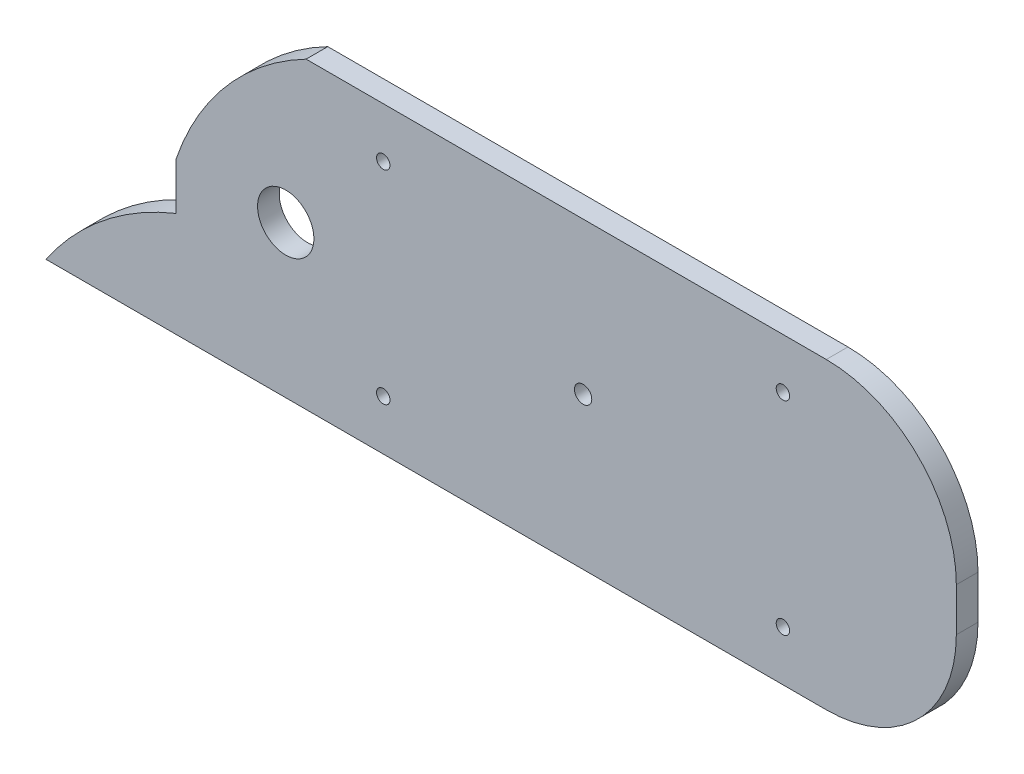
ISO-10303-21;
HEADER;
FILE_DESCRIPTION(('STEP AP214'),'2;1');
FILE_NAME('part.step','',(''),(''),'','','');
FILE_SCHEMA(('AUTOMOTIVE_DESIGN { 1 0 10303 214 1 1 1 1 }'));
ENDSEC;
DATA;
#1=APPLICATION_CONTEXT('core data for automotive mechanical design processes');
#2=APPLICATION_PROTOCOL_DEFINITION('international standard','automotive_design',2000,#1);
#3=PRODUCT_CONTEXT('',#1,'mechanical');
#4=PRODUCT('Part','Part','',(#3));
#5=PRODUCT_RELATED_PRODUCT_CATEGORY('part','',(#4));
#6=PRODUCT_DEFINITION_FORMATION('','',#4);
#7=PRODUCT_DEFINITION_CONTEXT('part definition',#1,'design');
#8=PRODUCT_DEFINITION('design','',#6,#7);
#9=PRODUCT_DEFINITION_SHAPE('','',#8);
#10=(LENGTH_UNIT() NAMED_UNIT(*) SI_UNIT(.MILLI.,.METRE.));
#11=(NAMED_UNIT(*) PLANE_ANGLE_UNIT() SI_UNIT($,.RADIAN.));
#12=(NAMED_UNIT(*) SI_UNIT($,.STERADIAN.) SOLID_ANGLE_UNIT());
#13=UNCERTAINTY_MEASURE_WITH_UNIT(LENGTH_MEASURE(1.E-05),#10,'distance_accuracy_value','');
#14=(GEOMETRIC_REPRESENTATION_CONTEXT(3) GLOBAL_UNCERTAINTY_ASSIGNED_CONTEXT((#13)) GLOBAL_UNIT_ASSIGNED_CONTEXT((#10,
#11,#12)) REPRESENTATION_CONTEXT('',''));
#15=CARTESIAN_POINT('',(0.,0.,0.));
#16=DIRECTION('',(0.,0.,1.));
#17=DIRECTION('',(1.,0.,0.));
#18=AXIS2_PLACEMENT_3D('',#15,#16,#17);
#19=CARTESIAN_POINT('',(138.386915245051,-93.7571467165055,12.7));
#20=DIRECTION('',(0.,0.,-1.));
#21=DIRECTION('',(-1.,0.,0.));
#22=AXIS2_PLACEMENT_3D('',#19,#20,#21);
#23=CYLINDRICAL_SURFACE('',#22,167.156635738642);
#24=CARTESIAN_POINT('',(138.386915245051,-93.7571467165055,0.));
#25=DIRECTION('',(0.,0.,1.));
#26=DIRECTION('',(-1.,0.,0.));
#27=AXIS2_PLACEMENT_3D('',#24,#25,#26);
#28=CIRCLE('',#27,167.156635738642);
#29=CARTESIAN_POINT('',(76.2,61.4012511991924,0.));
#30=VERTEX_POINT('',#29);
#31=CARTESIAN_POINT('',(0.,0.,0.));
#32=VERTEX_POINT('',#31);
#33=EDGE_CURVE('E152',#30,#32,#28,.T.);
#34=ORIENTED_EDGE('',*,*,#33,.T.);
#35=DIRECTION('',(0.,0.,-1.));
#36=VECTOR('',#35,1.);
#37=CARTESIAN_POINT('',(0.,0.,12.7));
#38=LINE('',#37,#36);
#39=CARTESIAN_POINT('',(0.,0.,12.7));
#40=VERTEX_POINT('',#39);
#41=EDGE_CURVE('E11',#40,#32,#38,.T.);
#42=ORIENTED_EDGE('',*,*,#41,.F.);
#43=CARTESIAN_POINT('',(138.386915245051,-93.7571467165055,12.7));
#44=DIRECTION('',(0.,0.,1.));
#45=DIRECTION('',(-1.,0.,0.));
#46=AXIS2_PLACEMENT_3D('',#43,#44,#45);
#47=CIRCLE('',#46,167.156635738642);
#48=CARTESIAN_POINT('',(76.2,61.4012511991924,12.7));
#49=VERTEX_POINT('',#48);
#50=EDGE_CURVE('E174',#49,#40,#47,.T.);
#51=ORIENTED_EDGE('',*,*,#50,.F.);
#52=DIRECTION('',(0.,0.,-1.));
#53=VECTOR('',#52,1.);
#54=CARTESIAN_POINT('',(76.2,61.4012511991924,12.7));
#55=LINE('',#54,#53);
#56=EDGE_CURVE('E148',#49,#30,#55,.T.);
#57=ORIENTED_EDGE('',*,*,#56,.T.);
#58=EDGE_LOOP('',(#34,#42,#51,#57));
#59=FACE_BOUND('',#58,.T.);
#60=ADVANCED_FACE('F47',(#59),#23,.T.);
#61=CARTESIAN_POINT('',(0.,0.,12.7));
#62=DIRECTION('',(0.,1.,0.));
#63=DIRECTION('',(-1.,0.,0.));
#64=AXIS2_PLACEMENT_3D('',#61,#62,#63);
#65=PLANE('',#64);
#66=DIRECTION('',(1.,0.,0.));
#67=VECTOR('',#66,1.);
#68=CARTESIAN_POINT('',(0.,0.,0.));
#69=LINE('',#68,#67);
#70=CARTESIAN_POINT('',(457.2,1.11022302462516E-13,0.));
#71=VERTEX_POINT('',#70);
#72=EDGE_CURVE('E156',#32,#71,#69,.T.);
#73=ORIENTED_EDGE('',*,*,#72,.T.);
#74=DIRECTION('',(0.,0.,-1.));
#75=VECTOR('',#74,1.);
#76=CARTESIAN_POINT('',(457.2,1.11022302462516E-13,12.7));
#77=LINE('',#76,#75);
#78=CARTESIAN_POINT('',(457.2,1.11022302462516E-13,12.7));
#79=VERTEX_POINT('',#78);
#80=EDGE_CURVE('E56',#79,#71,#77,.T.);
#81=ORIENTED_EDGE('',*,*,#80,.F.);
#82=DIRECTION('',(1.,0.,0.));
#83=VECTOR('',#82,1.);
#84=CARTESIAN_POINT('',(0.,0.,12.7));
#85=LINE('',#84,#83);
#86=EDGE_CURVE('E107',#40,#79,#85,.T.);
#87=ORIENTED_EDGE('',*,*,#86,.F.);
#88=ORIENTED_EDGE('',*,*,#41,.T.);
#89=EDGE_LOOP('',(#73,#81,#87,#88));
#90=FACE_BOUND('',#89,.T.);
#91=ADVANCED_FACE('F295',(#90),#65,.F.);
#92=CARTESIAN_POINT('',(457.2,76.2000000000001,12.7));
#93=DIRECTION('',(0.,0.,-1.));
#94=DIRECTION('',(-1.,0.,0.));
#95=AXIS2_PLACEMENT_3D('',#92,#93,#94);
#96=CYLINDRICAL_SURFACE('',#95,76.2);
#97=CARTESIAN_POINT('',(457.2,76.2000000000001,0.));
#98=DIRECTION('',(0.,0.,1.));
#99=DIRECTION('',(1.,0.,0.));
#100=AXIS2_PLACEMENT_3D('',#97,#98,#99);
#101=CIRCLE('',#100,76.2);
#102=CARTESIAN_POINT('',(533.4,76.2000000000001,0.));
#103=VERTEX_POINT('',#102);
#104=EDGE_CURVE('E160',#71,#103,#101,.T.);
#105=ORIENTED_EDGE('',*,*,#104,.T.);
#106=DIRECTION('',(0.,0.,-1.));
#107=VECTOR('',#106,1.);
#108=CARTESIAN_POINT('',(533.4,76.2000000000001,12.7));
#109=LINE('',#108,#107);
#110=CARTESIAN_POINT('',(533.4,76.2000000000001,12.7));
#111=VERTEX_POINT('',#110);
#112=EDGE_CURVE('E184',#111,#103,#109,.T.);
#113=ORIENTED_EDGE('',*,*,#112,.F.);
#114=CARTESIAN_POINT('',(457.2,76.2000000000001,12.7));
#115=DIRECTION('',(0.,0.,1.));
#116=DIRECTION('',(1.,0.,0.));
#117=AXIS2_PLACEMENT_3D('',#114,#115,#116);
#118=CIRCLE('',#117,76.2);
#119=EDGE_CURVE('E196',#79,#111,#118,.T.);
#120=ORIENTED_EDGE('',*,*,#119,.F.);
#121=ORIENTED_EDGE('',*,*,#80,.T.);
#122=EDGE_LOOP('',(#105,#113,#120,#121));
#123=FACE_BOUND('',#122,.T.);
#124=ADVANCED_FACE('F194',(#123),#96,.T.);
#125=CARTESIAN_POINT('',(533.4,76.2000000000001,12.7));
#126=DIRECTION('',(-1.,0.,0.));
#127=DIRECTION('',(0.,-1.,0.));
#128=AXIS2_PLACEMENT_3D('',#125,#126,#127);
#129=PLANE('',#128);
#130=DIRECTION('',(0.,1.,0.));
#131=VECTOR('',#130,1.);
#132=CARTESIAN_POINT('',(533.4,76.2000000000001,0.));
#133=LINE('',#132,#131);
#134=CARTESIAN_POINT('',(533.4,101.6,0.));
#135=VERTEX_POINT('',#134);
#136=EDGE_CURVE('E163',#103,#135,#133,.T.);
#137=ORIENTED_EDGE('',*,*,#136,.T.);
#138=DIRECTION('',(0.,0.,-1.));
#139=VECTOR('',#138,1.);
#140=CARTESIAN_POINT('',(533.4,101.6,12.7));
#141=LINE('',#140,#139);
#142=CARTESIAN_POINT('',(533.4,101.6,12.7));
#143=VERTEX_POINT('',#142);
#144=EDGE_CURVE('E180',#143,#135,#141,.T.);
#145=ORIENTED_EDGE('',*,*,#144,.F.);
#146=DIRECTION('',(0.,1.,0.));
#147=VECTOR('',#146,1.);
#148=CARTESIAN_POINT('',(533.4,76.2000000000001,12.7));
#149=LINE('',#148,#147);
#150=EDGE_CURVE('E209',#111,#143,#149,.T.);
#151=ORIENTED_EDGE('',*,*,#150,.F.);
#152=ORIENTED_EDGE('',*,*,#112,.T.);
#153=EDGE_LOOP('',(#137,#145,#151,#152));
#154=FACE_BOUND('',#153,.T.);
#155=ADVANCED_FACE('F204',(#154),#129,.F.);
#156=CARTESIAN_POINT('',(457.2,101.6,12.7));
#157=DIRECTION('',(0.,0.,-1.));
#158=DIRECTION('',(-1.,0.,0.));
#159=AXIS2_PLACEMENT_3D('',#156,#157,#158);
#160=CYLINDRICAL_SURFACE('',#159,76.2);
#161=CARTESIAN_POINT('',(457.2,101.6,0.));
#162=DIRECTION('',(0.,0.,1.));
#163=DIRECTION('',(1.,0.,0.));
#164=AXIS2_PLACEMENT_3D('',#161,#162,#163);
#165=CIRCLE('',#164,76.2);
#166=CARTESIAN_POINT('',(457.2,177.8,0.));
#167=VERTEX_POINT('',#166);
#168=EDGE_CURVE('E166',#135,#167,#165,.T.);
#169=ORIENTED_EDGE('',*,*,#168,.T.);
#170=DIRECTION('',(0.,0.,-1.));
#171=VECTOR('',#170,1.);
#172=CARTESIAN_POINT('',(457.2,177.8,12.7));
#173=LINE('',#172,#171);
#174=CARTESIAN_POINT('',(457.2,177.8,12.7));
#175=VERTEX_POINT('',#174);
#176=EDGE_CURVE('E137',#175,#167,#173,.T.);
#177=ORIENTED_EDGE('',*,*,#176,.F.);
#178=CARTESIAN_POINT('',(457.2,101.6,12.7));
#179=DIRECTION('',(0.,0.,1.));
#180=DIRECTION('',(1.,0.,0.));
#181=AXIS2_PLACEMENT_3D('',#178,#179,#180);
#182=CIRCLE('',#181,76.2);
#183=EDGE_CURVE('E126',#143,#175,#182,.T.);
#184=ORIENTED_EDGE('',*,*,#183,.F.);
#185=ORIENTED_EDGE('',*,*,#144,.T.);
#186=EDGE_LOOP('',(#169,#177,#184,#185));
#187=FACE_BOUND('',#186,.T.);
#188=ADVANCED_FACE('F207',(#187),#160,.T.);
#189=CARTESIAN_POINT('',(457.2,177.8,12.7));
#190=DIRECTION('',(0.,-1.,0.));
#191=DIRECTION('',(1.,0.,0.));
#192=AXIS2_PLACEMENT_3D('',#189,#190,#191);
#193=PLANE('',#192);
#194=DIRECTION('',(-1.,0.,0.));
#195=VECTOR('',#194,1.);
#196=CARTESIAN_POINT('',(457.2,177.8,0.));
#197=LINE('',#196,#195);
#198=CARTESIAN_POINT('',(152.4,177.8,0.));
#199=VERTEX_POINT('',#198);
#200=EDGE_CURVE('E135',#167,#199,#197,.T.);
#201=ORIENTED_EDGE('',*,*,#200,.T.);
#202=DIRECTION('',(0.,0.,-1.));
#203=VECTOR('',#202,1.);
#204=CARTESIAN_POINT('',(152.4,177.8,12.7));
#205=LINE('',#204,#203);
#206=CARTESIAN_POINT('',(152.4,177.8,12.7));
#207=VERTEX_POINT('',#206);
#208=EDGE_CURVE('E132',#207,#199,#205,.T.);
#209=ORIENTED_EDGE('',*,*,#208,.F.);
#210=DIRECTION('',(-1.,0.,0.));
#211=VECTOR('',#210,1.);
#212=CARTESIAN_POINT('',(457.2,177.8,12.7));
#213=LINE('',#212,#211);
#214=EDGE_CURVE('E120',#175,#207,#213,.T.);
#215=ORIENTED_EDGE('',*,*,#214,.F.);
#216=ORIENTED_EDGE('',*,*,#176,.T.);
#217=EDGE_LOOP('',(#201,#209,#215,#216));
#218=FACE_BOUND('',#217,.T.);
#219=ADVANCED_FACE('F133',(#218),#193,.F.);
#220=CARTESIAN_POINT('',(224.292528583713,39.0706897853889,12.7));
#221=DIRECTION('',(0.,0.,-1.));
#222=DIRECTION('',(-1.,0.,0.));
#223=AXIS2_PLACEMENT_3D('',#220,#221,#222);
#224=CYLINDRICAL_SURFACE('',#223,156.250942969256);
#225=CARTESIAN_POINT('',(224.292528583713,39.0706897853889,0.));
#226=DIRECTION('',(0.,0.,1.));
#227=DIRECTION('',(-1.,0.,0.));
#228=AXIS2_PLACEMENT_3D('',#225,#226,#227);
#229=CIRCLE('',#228,156.250942969256);
#230=CARTESIAN_POINT('',(76.2,88.9,0.));
#231=VERTEX_POINT('',#230);
#232=EDGE_CURVE('E93',#199,#231,#229,.T.);
#233=ORIENTED_EDGE('',*,*,#232,.T.);
#234=DIRECTION('',(0.,0.,-1.));
#235=VECTOR('',#234,1.);
#236=CARTESIAN_POINT('',(76.2,88.9,12.7));
#237=LINE('',#236,#235);
#238=CARTESIAN_POINT('',(76.2,88.9,12.7));
#239=VERTEX_POINT('',#238);
#240=EDGE_CURVE('E138',#239,#231,#237,.T.);
#241=ORIENTED_EDGE('',*,*,#240,.F.);
#242=CARTESIAN_POINT('',(224.292528583713,39.0706897853889,12.7));
#243=DIRECTION('',(0.,0.,1.));
#244=DIRECTION('',(-1.,0.,0.));
#245=AXIS2_PLACEMENT_3D('',#242,#243,#244);
#246=CIRCLE('',#245,156.250942969256);
#247=EDGE_CURVE('E124',#207,#239,#246,.T.);
#248=ORIENTED_EDGE('',*,*,#247,.F.);
#249=ORIENTED_EDGE('',*,*,#208,.T.);
#250=EDGE_LOOP('',(#233,#241,#248,#249));
#251=FACE_BOUND('',#250,.T.);
#252=ADVANCED_FACE('F140',(#251),#224,.T.);
#253=CARTESIAN_POINT('',(76.2,88.9,12.7));
#254=DIRECTION('',(1.,0.,0.));
#255=DIRECTION('',(0.,0.,-1.));
#256=AXIS2_PLACEMENT_3D('',#253,#254,#255);
#257=PLANE('',#256);
#258=DIRECTION('',(0.,-1.,0.));
#259=VECTOR('',#258,1.);
#260=CARTESIAN_POINT('',(76.2,88.9,0.));
#261=LINE('',#260,#259);
#262=EDGE_CURVE('E99',#231,#30,#261,.T.);
#263=ORIENTED_EDGE('',*,*,#262,.T.);
#264=ORIENTED_EDGE('',*,*,#56,.F.);
#265=DIRECTION('',(0.,-1.,0.));
#266=VECTOR('',#265,1.);
#267=CARTESIAN_POINT('',(76.2,88.9,12.7));
#268=LINE('',#267,#266);
#269=EDGE_CURVE('E64',#239,#49,#268,.T.);
#270=ORIENTED_EDGE('',*,*,#269,.F.);
#271=ORIENTED_EDGE('',*,*,#240,.T.);
#272=EDGE_LOOP('',(#263,#264,#270,#271));
#273=FACE_BOUND('',#272,.T.);
#274=ADVANCED_FACE('F274',(#273),#257,.F.);
#275=CARTESIAN_POINT('',(138.386915245051,-93.7571467165055,12.7));
#276=DIRECTION('',(0.,0.,-1.));
#277=DIRECTION('',(-1.,0.,0.));
#278=AXIS2_PLACEMENT_3D('',#275,#276,#277);
#279=PLANE('',#278);
#280=CARTESIAN_POINT('',(197.612,29.3624000000001,12.7));
#281=DIRECTION('',(0.,0.,1.));
#282=DIRECTION('',(1.,0.,0.));
#283=AXIS2_PLACEMENT_3D('',#280,#281,#282);
#284=CIRCLE('',#283,3.93699999999997);
#285=CARTESIAN_POINT('',(201.549,29.3624000000001,12.7));
#286=VERTEX_POINT('',#285);
#287=EDGE_CURVE('E249',#286,#286,#284,.T.);
#288=ORIENTED_EDGE('',*,*,#287,.F.);
#289=EDGE_LOOP('',(#288));
#290=FACE_BOUND('',#289,.T.);
#291=CARTESIAN_POINT('',(197.612,148.4376,12.7));
#292=DIRECTION('',(0.,0.,1.));
#293=DIRECTION('',(-1.,0.,0.));
#294=AXIS2_PLACEMENT_3D('',#291,#292,#293);
#295=CIRCLE('',#294,3.937);
#296=CARTESIAN_POINT('',(193.675,148.4376,12.7));
#297=VERTEX_POINT('',#296);
#298=EDGE_CURVE('E234',#297,#297,#295,.T.);
#299=ORIENTED_EDGE('',*,*,#298,.F.);
#300=EDGE_LOOP('',(#299));
#301=FACE_BOUND('',#300,.T.);
#302=CARTESIAN_POINT('',(140.468339853235,88.9,12.7));
#303=DIRECTION('',(0.,0.,1.));
#304=DIRECTION('',(1.,0.,0.));
#305=AXIS2_PLACEMENT_3D('',#302,#303,#304);
#306=CIRCLE('',#305,16.51);
#307=CARTESIAN_POINT('',(156.978339853235,88.9,12.7));
#308=VERTEX_POINT('',#307);
#309=EDGE_CURVE('E233',#308,#308,#306,.T.);
#310=ORIENTED_EDGE('',*,*,#309,.F.);
#311=EDGE_LOOP('',(#310));
#312=FACE_BOUND('',#311,.T.);
#313=CARTESIAN_POINT('',(431.8,148.4376,12.7));
#314=DIRECTION('',(0.,0.,1.));
#315=DIRECTION('',(1.,0.,0.));
#316=AXIS2_PLACEMENT_3D('',#313,#314,#315);
#317=CIRCLE('',#316,3.937);
#318=CARTESIAN_POINT('',(435.737,148.4376,12.7));
#319=VERTEX_POINT('',#318);
#320=EDGE_CURVE('E225',#319,#319,#317,.T.);
#321=ORIENTED_EDGE('',*,*,#320,.F.);
#322=EDGE_LOOP('',(#321));
#323=FACE_BOUND('',#322,.T.);
#324=CARTESIAN_POINT('',(431.8,29.3624,12.7));
#325=DIRECTION('',(0.,0.,1.));
#326=DIRECTION('',(-1.,0.,0.));
#327=AXIS2_PLACEMENT_3D('',#324,#325,#326);
#328=CIRCLE('',#327,3.93699999999994);
#329=CARTESIAN_POINT('',(427.863,29.3624,12.7));
#330=VERTEX_POINT('',#329);
#331=EDGE_CURVE('E250',#330,#330,#328,.T.);
#332=ORIENTED_EDGE('',*,*,#331,.F.);
#333=EDGE_LOOP('',(#332));
#334=FACE_BOUND('',#333,.T.);
#335=CARTESIAN_POINT('',(314.706,88.9,12.7));
#336=DIRECTION('',(0.,0.,1.));
#337=DIRECTION('',(1.,0.,0.));
#338=AXIS2_PLACEMENT_3D('',#335,#336,#337);
#339=CIRCLE('',#338,5.08000000000002);
#340=CARTESIAN_POINT('',(319.786,88.9,12.7));
#341=VERTEX_POINT('',#340);
#342=EDGE_CURVE('E221',#341,#341,#339,.T.);
#343=ORIENTED_EDGE('',*,*,#342,.F.);
#344=EDGE_LOOP('',(#343));
#345=FACE_BOUND('',#344,.T.);
#346=ORIENTED_EDGE('',*,*,#50,.T.);
#347=ORIENTED_EDGE('',*,*,#86,.T.);
#348=ORIENTED_EDGE('',*,*,#119,.T.);
#349=ORIENTED_EDGE('',*,*,#150,.T.);
#350=ORIENTED_EDGE('',*,*,#183,.T.);
#351=ORIENTED_EDGE('',*,*,#214,.T.);
#352=ORIENTED_EDGE('',*,*,#247,.T.);
#353=ORIENTED_EDGE('',*,*,#269,.T.);
#354=EDGE_LOOP('',(#346,#347,#348,#349,#350,#351,#352,#353));
#355=FACE_BOUND('',#354,.T.);
#356=ADVANCED_FACE('F122',(#290,#301,#312,#323,#334,#345,#355),#279,.F.);
#357=CARTESIAN_POINT('',(138.386915245051,-93.7571467165055,0.));
#358=DIRECTION('',(0.,0.,-1.));
#359=DIRECTION('',(-1.,0.,0.));
#360=AXIS2_PLACEMENT_3D('',#357,#358,#359);
#361=PLANE('',#360);
#362=CARTESIAN_POINT('',(197.612,29.3624000000001,0.));
#363=DIRECTION('',(0.,0.,1.));
#364=DIRECTION('',(1.,0.,0.));
#365=AXIS2_PLACEMENT_3D('',#362,#363,#364);
#366=CIRCLE('',#365,3.93699999999997);
#367=CARTESIAN_POINT('',(201.549,29.3624000000001,0.));
#368=VERTEX_POINT('',#367);
#369=EDGE_CURVE('E245',#368,#368,#366,.T.);
#370=ORIENTED_EDGE('',*,*,#369,.T.);
#371=EDGE_LOOP('',(#370));
#372=FACE_BOUND('',#371,.T.);
#373=CARTESIAN_POINT('',(197.612,148.4376,0.));
#374=DIRECTION('',(0.,0.,1.));
#375=DIRECTION('',(-1.,0.,0.));
#376=AXIS2_PLACEMENT_3D('',#373,#374,#375);
#377=CIRCLE('',#376,3.937);
#378=CARTESIAN_POINT('',(193.675,148.4376,0.));
#379=VERTEX_POINT('',#378);
#380=EDGE_CURVE('E254',#379,#379,#377,.T.);
#381=ORIENTED_EDGE('',*,*,#380,.T.);
#382=EDGE_LOOP('',(#381));
#383=FACE_BOUND('',#382,.T.);
#384=CARTESIAN_POINT('',(140.468339853235,88.9,0.));
#385=DIRECTION('',(0.,0.,1.));
#386=DIRECTION('',(1.,0.,0.));
#387=AXIS2_PLACEMENT_3D('',#384,#385,#386);
#388=CIRCLE('',#387,16.51);
#389=CARTESIAN_POINT('',(156.978339853235,88.9,0.));
#390=VERTEX_POINT('',#389);
#391=EDGE_CURVE('E229',#390,#390,#388,.T.);
#392=ORIENTED_EDGE('',*,*,#391,.T.);
#393=EDGE_LOOP('',(#392));
#394=FACE_BOUND('',#393,.T.);
#395=CARTESIAN_POINT('',(431.8,148.4376,0.));
#396=DIRECTION('',(0.,0.,1.));
#397=DIRECTION('',(1.,0.,0.));
#398=AXIS2_PLACEMENT_3D('',#395,#396,#397);
#399=CIRCLE('',#398,3.937);
#400=CARTESIAN_POINT('',(435.737,148.4376,0.));
#401=VERTEX_POINT('',#400);
#402=EDGE_CURVE('E238',#401,#401,#399,.T.);
#403=ORIENTED_EDGE('',*,*,#402,.T.);
#404=EDGE_LOOP('',(#403));
#405=FACE_BOUND('',#404,.T.);
#406=CARTESIAN_POINT('',(431.8,29.3624,0.));
#407=DIRECTION('',(0.,0.,1.));
#408=DIRECTION('',(-1.,0.,0.));
#409=AXIS2_PLACEMENT_3D('',#406,#407,#408);
#410=CIRCLE('',#409,3.93699999999994);
#411=CARTESIAN_POINT('',(427.863,29.3624,0.));
#412=VERTEX_POINT('',#411);
#413=EDGE_CURVE('E261',#412,#412,#410,.T.);
#414=ORIENTED_EDGE('',*,*,#413,.T.);
#415=EDGE_LOOP('',(#414));
#416=FACE_BOUND('',#415,.T.);
#417=CARTESIAN_POINT('',(314.706,88.9,0.));
#418=DIRECTION('',(0.,0.,1.));
#419=DIRECTION('',(1.,0.,0.));
#420=AXIS2_PLACEMENT_3D('',#417,#418,#419);
#421=CIRCLE('',#420,5.08000000000002);
#422=CARTESIAN_POINT('',(319.786,88.9,0.));
#423=VERTEX_POINT('',#422);
#424=EDGE_CURVE('E157',#423,#423,#421,.T.);
#425=ORIENTED_EDGE('',*,*,#424,.T.);
#426=EDGE_LOOP('',(#425));
#427=FACE_BOUND('',#426,.T.);
#428=ORIENTED_EDGE('',*,*,#33,.F.);
#429=ORIENTED_EDGE('',*,*,#262,.F.);
#430=ORIENTED_EDGE('',*,*,#232,.F.);
#431=ORIENTED_EDGE('',*,*,#200,.F.);
#432=ORIENTED_EDGE('',*,*,#168,.F.);
#433=ORIENTED_EDGE('',*,*,#136,.F.);
#434=ORIENTED_EDGE('',*,*,#104,.F.);
#435=ORIENTED_EDGE('',*,*,#72,.F.);
#436=EDGE_LOOP('',(#428,#429,#430,#431,#432,#433,#434,#435));
#437=FACE_BOUND('',#436,.T.);
#438=ADVANCED_FACE('F200',(#372,#383,#394,#405,#416,#427,#437),#361,.T.);
#439=CARTESIAN_POINT('',(314.706,88.9,0.));
#440=DIRECTION('',(0.,0.,1.));
#441=DIRECTION('',(1.,0.,0.));
#442=AXIS2_PLACEMENT_3D('',#439,#440,#441);
#443=CYLINDRICAL_SURFACE('',#442,5.08000000000002);
#444=ORIENTED_EDGE('',*,*,#424,.F.);
#445=EDGE_LOOP('',(#444));
#446=FACE_BOUND('',#445,.T.);
#447=ORIENTED_EDGE('',*,*,#342,.T.);
#448=EDGE_LOOP('',(#447));
#449=FACE_BOUND('',#448,.T.);
#450=ADVANCED_FACE('F279',(#446,#449),#443,.F.);
#451=CARTESIAN_POINT('',(431.8,29.3624,0.));
#452=DIRECTION('',(0.,0.,1.));
#453=DIRECTION('',(1.,0.,0.));
#454=AXIS2_PLACEMENT_3D('',#451,#452,#453);
#455=CYLINDRICAL_SURFACE('',#454,3.93699999999994);
#456=ORIENTED_EDGE('',*,*,#413,.F.);
#457=EDGE_LOOP('',(#456));
#458=FACE_BOUND('',#457,.T.);
#459=ORIENTED_EDGE('',*,*,#331,.T.);
#460=EDGE_LOOP('',(#459));
#461=FACE_BOUND('',#460,.T.);
#462=ADVANCED_FACE('F270',(#458,#461),#455,.F.);
#463=CARTESIAN_POINT('',(431.8,148.4376,0.));
#464=DIRECTION('',(0.,0.,1.));
#465=DIRECTION('',(1.,0.,0.));
#466=AXIS2_PLACEMENT_3D('',#463,#464,#465);
#467=CYLINDRICAL_SURFACE('',#466,3.937);
#468=ORIENTED_EDGE('',*,*,#402,.F.);
#469=EDGE_LOOP('',(#468));
#470=FACE_BOUND('',#469,.T.);
#471=ORIENTED_EDGE('',*,*,#320,.T.);
#472=EDGE_LOOP('',(#471));
#473=FACE_BOUND('',#472,.T.);
#474=ADVANCED_FACE('F287',(#470,#473),#467,.F.);
#475=CARTESIAN_POINT('',(140.468339853235,88.9,0.));
#476=DIRECTION('',(0.,0.,1.));
#477=DIRECTION('',(1.,0.,0.));
#478=AXIS2_PLACEMENT_3D('',#475,#476,#477);
#479=CYLINDRICAL_SURFACE('',#478,16.51);
#480=ORIENTED_EDGE('',*,*,#391,.F.);
#481=EDGE_LOOP('',(#480));
#482=FACE_BOUND('',#481,.T.);
#483=ORIENTED_EDGE('',*,*,#309,.T.);
#484=EDGE_LOOP('',(#483));
#485=FACE_BOUND('',#484,.T.);
#486=ADVANCED_FACE('F376',(#482,#485),#479,.F.);
#487=CARTESIAN_POINT('',(197.612,148.4376,0.));
#488=DIRECTION('',(0.,0.,1.));
#489=DIRECTION('',(1.,0.,0.));
#490=AXIS2_PLACEMENT_3D('',#487,#488,#489);
#491=CYLINDRICAL_SURFACE('',#490,3.937);
#492=ORIENTED_EDGE('',*,*,#380,.F.);
#493=EDGE_LOOP('',(#492));
#494=FACE_BOUND('',#493,.T.);
#495=ORIENTED_EDGE('',*,*,#298,.T.);
#496=EDGE_LOOP('',(#495));
#497=FACE_BOUND('',#496,.T.);
#498=ADVANCED_FACE('F386',(#494,#497),#491,.F.);
#499=CARTESIAN_POINT('',(197.612,29.3624000000001,0.));
#500=DIRECTION('',(0.,0.,1.));
#501=DIRECTION('',(1.,0.,0.));
#502=AXIS2_PLACEMENT_3D('',#499,#500,#501);
#503=CYLINDRICAL_SURFACE('',#502,3.93699999999997);
#504=ORIENTED_EDGE('',*,*,#369,.F.);
#505=EDGE_LOOP('',(#504));
#506=FACE_BOUND('',#505,.T.);
#507=ORIENTED_EDGE('',*,*,#287,.T.);
#508=EDGE_LOOP('',(#507));
#509=FACE_BOUND('',#508,.T.);
#510=ADVANCED_FACE('F395',(#506,#509),#503,.F.);
#511=CLOSED_SHELL('',(#60,#91,#124,#155,#188,#219,#252,#274,#356,#438,#450,#462,#474,#486,#498,#510));
#512=MANIFOLD_SOLID_BREP('B2',#511);
#513=ADVANCED_BREP_SHAPE_REPRESENTATION('',(#18,#512),#14);
#514=SHAPE_DEFINITION_REPRESENTATION(#9,#513);
ENDSEC;
END-ISO-10303-21;
